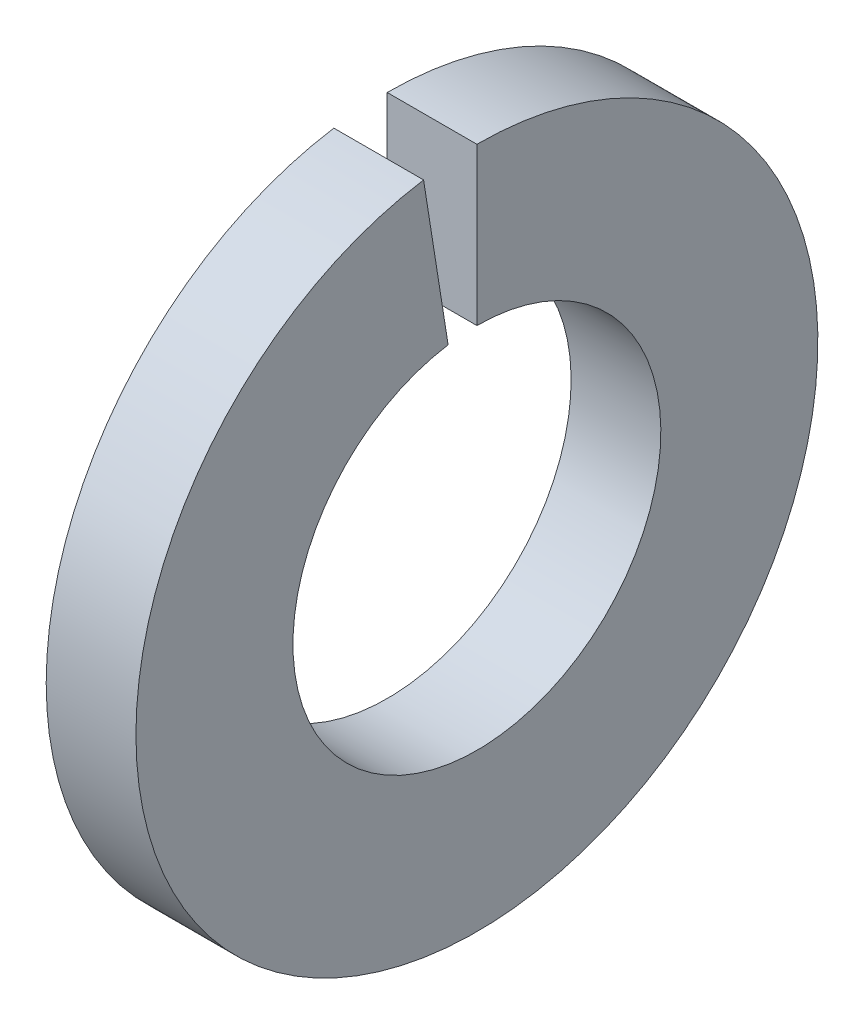
ISO-10303-21;
HEADER;
FILE_DESCRIPTION(('STEP AP214'),'2;1');
FILE_NAME('part.step','',(''),(''),'','','');
FILE_SCHEMA(('AUTOMOTIVE_DESIGN { 1 0 10303 214 1 1 1 1 }'));
ENDSEC;
DATA;
#1=APPLICATION_CONTEXT('core data for automotive mechanical design processes');
#2=APPLICATION_PROTOCOL_DEFINITION('international standard','automotive_design',2000,#1);
#3=PRODUCT_CONTEXT('',#1,'mechanical');
#4=PRODUCT('Part','Part','',(#3));
#5=PRODUCT_RELATED_PRODUCT_CATEGORY('part','',(#4));
#6=PRODUCT_DEFINITION_FORMATION('','',#4);
#7=PRODUCT_DEFINITION_CONTEXT('part definition',#1,'design');
#8=PRODUCT_DEFINITION('design','',#6,#7);
#9=PRODUCT_DEFINITION_SHAPE('','',#8);
#10=(LENGTH_UNIT() NAMED_UNIT(*) SI_UNIT(.MILLI.,.METRE.));
#11=(NAMED_UNIT(*) PLANE_ANGLE_UNIT() SI_UNIT($,.RADIAN.));
#12=(NAMED_UNIT(*) SI_UNIT($,.STERADIAN.) SOLID_ANGLE_UNIT());
#13=UNCERTAINTY_MEASURE_WITH_UNIT(LENGTH_MEASURE(1.E-05),#10,'distance_accuracy_value','');
#14=(GEOMETRIC_REPRESENTATION_CONTEXT(3) GLOBAL_UNCERTAINTY_ASSIGNED_CONTEXT((#13)) GLOBAL_UNIT_ASSIGNED_CONTEXT((#10,
#11,#12)) REPRESENTATION_CONTEXT('',''));
#15=CARTESIAN_POINT('',(0.,0.,0.));
#16=DIRECTION('',(0.,0.,1.));
#17=DIRECTION('',(1.,0.,0.));
#18=AXIS2_PLACEMENT_3D('',#15,#16,#17);
#19=CARTESIAN_POINT('',(-1.,0.,0.));
#20=DIRECTION('',(1.,0.,0.));
#21=DIRECTION('',(0.,0.,-1.));
#22=AXIS2_PLACEMENT_3D('',#19,#20,#21);
#23=CYLINDRICAL_SURFACE('',#22,3.8);
#24=CARTESIAN_POINT('',(0.,0.,0.));
#25=DIRECTION('',(1.,0.,0.));
#26=DIRECTION('',(0.,0.,-1.));
#27=AXIS2_PLACEMENT_3D('',#24,#25,#26);
#28=CIRCLE('',#27,3.8);
#29=CARTESIAN_POINT('',(0.,3.75321569426153,0.594450967152878));
#30=VERTEX_POINT('',#29);
#31=CARTESIAN_POINT('',(0.,3.8,0.));
#32=VERTEX_POINT('',#31);
#33=EDGE_CURVE('E80',#30,#32,#28,.T.);
#34=ORIENTED_EDGE('',*,*,#33,.F.);
#35=DIRECTION('',(1.,0.,0.));
#36=VECTOR('',#35,1.);
#37=CARTESIAN_POINT('',(-1.,3.75321569426153,0.594450967152878));
#38=LINE('',#37,#36);
#39=CARTESIAN_POINT('',(-1.,3.75321569426153,0.594450967152878));
#40=VERTEX_POINT('',#39);
#41=EDGE_CURVE('E11',#40,#30,#38,.T.);
#42=ORIENTED_EDGE('',*,*,#41,.F.);
#43=CARTESIAN_POINT('',(-1.,0.,0.));
#44=DIRECTION('',(1.,0.,0.));
#45=DIRECTION('',(0.,0.,-1.));
#46=AXIS2_PLACEMENT_3D('',#43,#44,#45);
#47=CIRCLE('',#46,3.8);
#48=CARTESIAN_POINT('',(-1.,3.8,0.));
#49=VERTEX_POINT('',#48);
#50=EDGE_CURVE('E74',#40,#49,#47,.T.);
#51=ORIENTED_EDGE('',*,*,#50,.T.);
#52=DIRECTION('',(1.,0.,0.));
#53=VECTOR('',#52,1.);
#54=CARTESIAN_POINT('',(-1.,3.8,0.));
#55=LINE('',#54,#53);
#56=EDGE_CURVE('E19',#49,#32,#55,.T.);
#57=ORIENTED_EDGE('',*,*,#56,.T.);
#58=EDGE_LOOP('',(#34,#42,#51,#57));
#59=FACE_BOUND('',#58,.T.);
#60=ADVANCED_FACE('F16',(#59),#23,.T.);
#61=CARTESIAN_POINT('',(-1.,3.75321569426153,0.594450967152878));
#62=DIRECTION('',(0.,0.156434465040232,-0.987688340595138));
#63=DIRECTION('',(0.,0.987688340595138,0.156434465040232));
#64=AXIS2_PLACEMENT_3D('',#61,#62,#63);
#65=PLANE('',#64);
#66=DIRECTION('',(0.,0.987688340595138,0.156434465040232));
#67=VECTOR('',#66,1.);
#68=CARTESIAN_POINT('',(0.,3.75321569426153,0.594450967152878));
#69=LINE('',#68,#67);
#70=CARTESIAN_POINT('',(0.,2.02476109822003,0.320690653332473));
#71=VERTEX_POINT('',#70);
#72=EDGE_CURVE('E76',#71,#30,#69,.T.);
#73=ORIENTED_EDGE('',*,*,#72,.F.);
#74=DIRECTION('',(1.,0.,0.));
#75=VECTOR('',#74,1.);
#76=CARTESIAN_POINT('',(-1.,2.02476109822003,0.320690653332473));
#77=LINE('',#76,#75);
#78=CARTESIAN_POINT('',(-1.,2.02476109822003,0.320690653332473));
#79=VERTEX_POINT('',#78);
#80=EDGE_CURVE('E25',#79,#71,#77,.T.);
#81=ORIENTED_EDGE('',*,*,#80,.F.);
#82=DIRECTION('',(0.,0.987688340595138,0.156434465040232));
#83=VECTOR('',#82,1.);
#84=CARTESIAN_POINT('',(-1.,3.75321569426153,0.594450967152878));
#85=LINE('',#84,#83);
#86=EDGE_CURVE('E71',#79,#40,#85,.T.);
#87=ORIENTED_EDGE('',*,*,#86,.T.);
#88=ORIENTED_EDGE('',*,*,#41,.T.);
#89=EDGE_LOOP('',(#73,#81,#87,#88));
#90=FACE_BOUND('',#89,.T.);
#91=ADVANCED_FACE('F90',(#90),#65,.T.);
#92=CARTESIAN_POINT('',(-1.,0.,0.));
#93=DIRECTION('',(1.,0.,0.));
#94=DIRECTION('',(0.,0.,-1.));
#95=AXIS2_PLACEMENT_3D('',#92,#93,#94);
#96=CYLINDRICAL_SURFACE('',#95,2.05);
#97=CARTESIAN_POINT('',(0.,0.,0.));
#98=DIRECTION('',(-1.,0.,0.));
#99=DIRECTION('',(0.,0.,-1.));
#100=AXIS2_PLACEMENT_3D('',#97,#98,#99);
#101=CIRCLE('',#100,2.05);
#102=CARTESIAN_POINT('',(0.,2.05,0.));
#103=VERTEX_POINT('',#102);
#104=EDGE_CURVE('E66',#103,#71,#101,.T.);
#105=ORIENTED_EDGE('',*,*,#104,.F.);
#106=DIRECTION('',(1.,0.,0.));
#107=VECTOR('',#106,1.);
#108=CARTESIAN_POINT('',(-1.,2.05,0.));
#109=LINE('',#108,#107);
#110=CARTESIAN_POINT('',(-1.,2.05,0.));
#111=VERTEX_POINT('',#110);
#112=EDGE_CURVE('E61',#111,#103,#109,.T.);
#113=ORIENTED_EDGE('',*,*,#112,.F.);
#114=CARTESIAN_POINT('',(-1.,0.,0.));
#115=DIRECTION('',(-1.,0.,0.));
#116=DIRECTION('',(0.,0.,-1.));
#117=AXIS2_PLACEMENT_3D('',#114,#115,#116);
#118=CIRCLE('',#117,2.05);
#119=EDGE_CURVE('E64',#111,#79,#118,.T.);
#120=ORIENTED_EDGE('',*,*,#119,.T.);
#121=ORIENTED_EDGE('',*,*,#80,.T.);
#122=EDGE_LOOP('',(#105,#113,#120,#121));
#123=FACE_BOUND('',#122,.T.);
#124=ADVANCED_FACE('F63',(#123),#96,.F.);
#125=CARTESIAN_POINT('',(-1.,3.8,0.));
#126=DIRECTION('',(0.,0.,1.));
#127=DIRECTION('',(0.,-1.,0.));
#128=AXIS2_PLACEMENT_3D('',#125,#126,#127);
#129=PLANE('',#128);
#130=DIRECTION('',(0.,-1.,0.));
#131=VECTOR('',#130,1.);
#132=CARTESIAN_POINT('',(0.,3.8,0.));
#133=LINE('',#132,#131);
#134=EDGE_CURVE('E83',#32,#103,#133,.T.);
#135=ORIENTED_EDGE('',*,*,#134,.F.);
#136=ORIENTED_EDGE('',*,*,#56,.F.);
#137=DIRECTION('',(0.,-1.,0.));
#138=VECTOR('',#137,1.);
#139=CARTESIAN_POINT('',(-1.,3.8,0.));
#140=LINE('',#139,#138);
#141=EDGE_CURVE('E70',#49,#111,#140,.T.);
#142=ORIENTED_EDGE('',*,*,#141,.T.);
#143=ORIENTED_EDGE('',*,*,#112,.T.);
#144=EDGE_LOOP('',(#135,#136,#142,#143));
#145=FACE_BOUND('',#144,.T.);
#146=ADVANCED_FACE('F73',(#145),#129,.T.);
#147=CARTESIAN_POINT('',(-1.,0.,0.));
#148=DIRECTION('',(1.,0.,0.));
#149=DIRECTION('',(0.,0.,-1.));
#150=AXIS2_PLACEMENT_3D('',#147,#148,#149);
#151=PLANE('',#150);
#152=ORIENTED_EDGE('',*,*,#50,.F.);
#153=ORIENTED_EDGE('',*,*,#86,.F.);
#154=ORIENTED_EDGE('',*,*,#119,.F.);
#155=ORIENTED_EDGE('',*,*,#141,.F.);
#156=EDGE_LOOP('',(#152,#153,#154,#155));
#157=FACE_BOUND('',#156,.T.);
#158=ADVANCED_FACE('F69',(#157),#151,.F.);
#159=CARTESIAN_POINT('',(0.,0.,0.));
#160=DIRECTION('',(1.,0.,0.));
#161=DIRECTION('',(0.,0.,-1.));
#162=AXIS2_PLACEMENT_3D('',#159,#160,#161);
#163=PLANE('',#162);
#164=ORIENTED_EDGE('',*,*,#33,.T.);
#165=ORIENTED_EDGE('',*,*,#134,.T.);
#166=ORIENTED_EDGE('',*,*,#104,.T.);
#167=ORIENTED_EDGE('',*,*,#72,.T.);
#168=EDGE_LOOP('',(#164,#165,#166,#167));
#169=FACE_BOUND('',#168,.T.);
#170=ADVANCED_FACE('F89',(#169),#163,.T.);
#171=CLOSED_SHELL('',(#60,#91,#124,#146,#158,#170));
#172=MANIFOLD_SOLID_BREP('B1',#171);
#173=ADVANCED_BREP_SHAPE_REPRESENTATION('',(#18,#172),#14);
#174=SHAPE_DEFINITION_REPRESENTATION(#9,#173);
ENDSEC;
END-ISO-10303-21;
